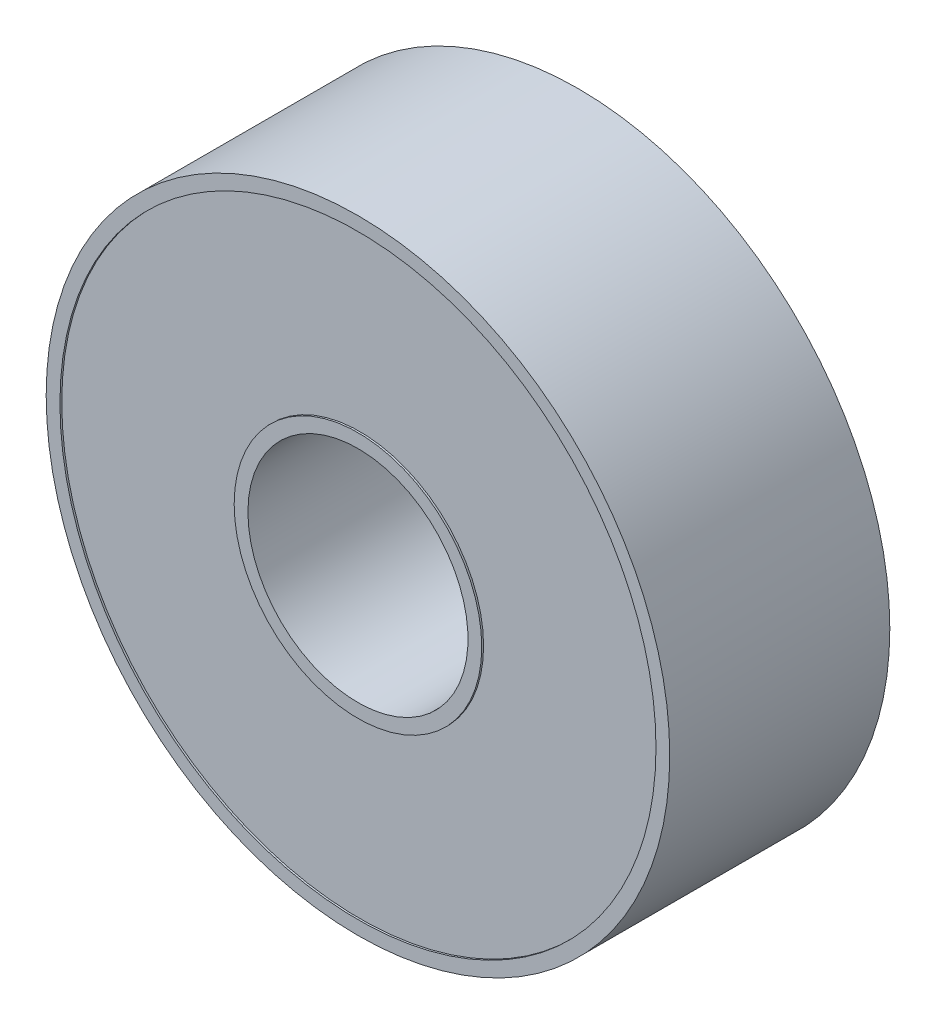
ISO-10303-21;
HEADER;
FILE_DESCRIPTION(('STEP AP214'),'2;1');
FILE_NAME('part.step','',(''),(''),'','','');
FILE_SCHEMA(('AUTOMOTIVE_DESIGN { 1 0 10303 214 1 1 1 1 }'));
ENDSEC;
DATA;
#1=APPLICATION_CONTEXT('core data for automotive mechanical design processes');
#2=APPLICATION_PROTOCOL_DEFINITION('international standard','automotive_design',2000,#1);
#3=PRODUCT_CONTEXT('',#1,'mechanical');
#4=PRODUCT('Part','Part','',(#3));
#5=PRODUCT_RELATED_PRODUCT_CATEGORY('part','',(#4));
#6=PRODUCT_DEFINITION_FORMATION('','',#4);
#7=PRODUCT_DEFINITION_CONTEXT('part definition',#1,'design');
#8=PRODUCT_DEFINITION('design','',#6,#7);
#9=PRODUCT_DEFINITION_SHAPE('','',#8);
#10=(LENGTH_UNIT() NAMED_UNIT(*) SI_UNIT(.MILLI.,.METRE.));
#11=(NAMED_UNIT(*) PLANE_ANGLE_UNIT() SI_UNIT($,.RADIAN.));
#12=(NAMED_UNIT(*) SI_UNIT($,.STERADIAN.) SOLID_ANGLE_UNIT());
#13=UNCERTAINTY_MEASURE_WITH_UNIT(LENGTH_MEASURE(1.E-05),#10,'distance_accuracy_value','');
#14=(GEOMETRIC_REPRESENTATION_CONTEXT(3) GLOBAL_UNCERTAINTY_ASSIGNED_CONTEXT((#13)) GLOBAL_UNIT_ASSIGNED_CONTEXT((#10,
#11,#12)) REPRESENTATION_CONTEXT('',''));
#15=CARTESIAN_POINT('',(0.,0.,0.));
#16=DIRECTION('',(0.,0.,1.));
#17=DIRECTION('',(1.,0.,0.));
#18=AXIS2_PLACEMENT_3D('',#15,#16,#17);
#19=CARTESIAN_POINT('',(0.,0.,0.));
#20=DIRECTION('',(0.,0.,1.));
#21=DIRECTION('',(1.,0.,0.));
#22=AXIS2_PLACEMENT_3D('',#19,#20,#21);
#23=PLANE('',#22);
#24=CARTESIAN_POINT('',(0.,0.,0.));
#25=DIRECTION('',(0.,0.,1.));
#26=DIRECTION('',(1.,0.,0.));
#27=AXIS2_PLACEMENT_3D('',#24,#25,#26);
#28=CIRCLE('',#27,8.5);
#29=CARTESIAN_POINT('',(-8.5,0.,0.));
#30=VERTEX_POINT('',#29);
#31=EDGE_CURVE('E40',#30,#30,#28,.T.);
#32=ORIENTED_EDGE('',*,*,#31,.F.);
#33=EDGE_LOOP('',(#32));
#34=FACE_BOUND('',#33,.T.);
#35=CARTESIAN_POINT('',(0.,0.,0.));
#36=DIRECTION('',(0.,0.,1.));
#37=DIRECTION('',(1.,0.,0.));
#38=AXIS2_PLACEMENT_3D('',#35,#36,#37);
#39=CIRCLE('',#38,8.125);
#40=CARTESIAN_POINT('',(-8.125,0.,0.));
#41=VERTEX_POINT('',#40);
#42=EDGE_CURVE('E10',#41,#41,#39,.T.);
#43=ORIENTED_EDGE('',*,*,#42,.T.);
#44=EDGE_LOOP('',(#43));
#45=FACE_BOUND('',#44,.T.);
#46=ADVANCED_FACE('F17',(#34,#45),#23,.F.);
#47=CARTESIAN_POINT('',(0.,0.,6.));
#48=DIRECTION('',(0.,0.,1.));
#49=DIRECTION('',(1.,0.,0.));
#50=AXIS2_PLACEMENT_3D('',#47,#48,#49);
#51=PLANE('',#50);
#52=CARTESIAN_POINT('',(0.,0.,6.));
#53=DIRECTION('',(0.,0.,1.));
#54=DIRECTION('',(1.,0.,0.));
#55=AXIS2_PLACEMENT_3D('',#52,#53,#54);
#56=CIRCLE('',#55,8.5);
#57=CARTESIAN_POINT('',(-8.5,0.,6.));
#58=VERTEX_POINT('',#57);
#59=EDGE_CURVE('E28',#58,#58,#56,.T.);
#60=ORIENTED_EDGE('',*,*,#59,.T.);
#61=EDGE_LOOP('',(#60));
#62=FACE_BOUND('',#61,.T.);
#63=CARTESIAN_POINT('',(0.,0.,6.));
#64=DIRECTION('',(0.,0.,-1.));
#65=DIRECTION('',(1.,0.,0.));
#66=AXIS2_PLACEMENT_3D('',#63,#64,#65);
#67=CIRCLE('',#66,8.125);
#68=CARTESIAN_POINT('',(-8.125,0.,6.));
#69=VERTEX_POINT('',#68);
#70=EDGE_CURVE('E173',#69,#69,#67,.T.);
#71=ORIENTED_EDGE('',*,*,#70,.T.);
#72=EDGE_LOOP('',(#71));
#73=FACE_BOUND('',#72,.T.);
#74=ADVANCED_FACE('F196',(#62,#73),#51,.T.);
#75=CARTESIAN_POINT('',(0.,0.,0.));
#76=DIRECTION('',(0.,0.,1.));
#77=DIRECTION('',(1.,0.,0.));
#78=AXIS2_PLACEMENT_3D('',#75,#76,#77);
#79=CYLINDRICAL_SURFACE('',#78,8.5);
#80=ORIENTED_EDGE('',*,*,#59,.F.);
#81=DIRECTION('',(0.,0.,-1.));
#82=VECTOR('',#81,1.);
#83=CARTESIAN_POINT('',(-8.5,0.,0.));
#84=LINE('',#83,#82);
#85=EDGE_CURVE('E169',#58,#30,#84,.T.);
#86=ORIENTED_EDGE('',*,*,#85,.T.);
#87=ORIENTED_EDGE('',*,*,#31,.T.);
#88=ORIENTED_EDGE('',*,*,#85,.F.);
#89=EDGE_LOOP('',(#80,#86,#87,#88));
#90=FACE_BOUND('',#89,.T.);
#91=ADVANCED_FACE('F194',(#90),#79,.T.);
#92=CARTESIAN_POINT('',(0.,0.,6.));
#93=DIRECTION('',(0.,0.,-1.));
#94=DIRECTION('',(1.,0.,0.));
#95=AXIS2_PLACEMENT_3D('',#92,#93,#94);
#96=CYLINDRICAL_SURFACE('',#95,8.125);
#97=ORIENTED_EDGE('',*,*,#70,.F.);
#98=DIRECTION('',(0.,0.,-1.));
#99=VECTOR('',#98,1.);
#100=CARTESIAN_POINT('',(-8.125,0.,6.));
#101=LINE('',#100,#99);
#102=CARTESIAN_POINT('',(-8.125,0.,5.95));
#103=VERTEX_POINT('',#102);
#104=EDGE_CURVE('E165',#69,#103,#101,.T.);
#105=ORIENTED_EDGE('',*,*,#104,.T.);
#106=CARTESIAN_POINT('',(0.,0.,5.95));
#107=DIRECTION('',(0.,0.,-1.));
#108=DIRECTION('',(1.,0.,0.));
#109=AXIS2_PLACEMENT_3D('',#106,#107,#108);
#110=CIRCLE('',#109,8.125);
#111=EDGE_CURVE('E161',#103,#103,#110,.T.);
#112=ORIENTED_EDGE('',*,*,#111,.T.);
#113=ORIENTED_EDGE('',*,*,#104,.F.);
#114=EDGE_LOOP('',(#97,#105,#112,#113));
#115=FACE_BOUND('',#114,.T.);
#116=ADVANCED_FACE('F202',(#115),#96,.F.);
#117=CARTESIAN_POINT('',(0.,0.,0.));
#118=DIRECTION('',(0.,0.,1.));
#119=DIRECTION('',(1.,0.,0.));
#120=AXIS2_PLACEMENT_3D('',#117,#118,#119);
#121=PLANE('',#120);
#122=CARTESIAN_POINT('',(0.,0.,0.));
#123=DIRECTION('',(0.,0.,-1.));
#124=DIRECTION('',(1.,0.,0.));
#125=AXIS2_PLACEMENT_3D('',#122,#123,#124);
#126=CIRCLE('',#125,3.375);
#127=CARTESIAN_POINT('',(-3.375,0.,0.));
#128=VERTEX_POINT('',#127);
#129=EDGE_CURVE('E150',#128,#128,#126,.T.);
#130=ORIENTED_EDGE('',*,*,#129,.T.);
#131=EDGE_LOOP('',(#130));
#132=FACE_BOUND('',#131,.T.);
#133=CARTESIAN_POINT('',(0.,0.,0.));
#134=DIRECTION('',(0.,0.,-1.));
#135=DIRECTION('',(1.,0.,0.));
#136=AXIS2_PLACEMENT_3D('',#133,#134,#135);
#137=CIRCLE('',#136,3.);
#138=CARTESIAN_POINT('',(-3.,0.,0.));
#139=VERTEX_POINT('',#138);
#140=EDGE_CURVE('E145',#139,#139,#137,.T.);
#141=ORIENTED_EDGE('',*,*,#140,.F.);
#142=EDGE_LOOP('',(#141));
#143=FACE_BOUND('',#142,.T.);
#144=ADVANCED_FACE('F217',(#132,#143),#121,.F.);
#145=CARTESIAN_POINT('',(0.,0.,6.));
#146=DIRECTION('',(0.,0.,1.));
#147=DIRECTION('',(1.,0.,0.));
#148=AXIS2_PLACEMENT_3D('',#145,#146,#147);
#149=PLANE('',#148);
#150=CARTESIAN_POINT('',(0.,0.,6.));
#151=DIRECTION('',(0.,0.,1.));
#152=DIRECTION('',(1.,0.,0.));
#153=AXIS2_PLACEMENT_3D('',#150,#151,#152);
#154=CIRCLE('',#153,3.375);
#155=CARTESIAN_POINT('',(-3.375,0.,6.));
#156=VERTEX_POINT('',#155);
#157=EDGE_CURVE('E146',#156,#156,#154,.T.);
#158=ORIENTED_EDGE('',*,*,#157,.T.);
#159=EDGE_LOOP('',(#158));
#160=FACE_BOUND('',#159,.T.);
#161=CARTESIAN_POINT('',(0.,0.,6.));
#162=DIRECTION('',(0.,0.,-1.));
#163=DIRECTION('',(1.,0.,0.));
#164=AXIS2_PLACEMENT_3D('',#161,#162,#163);
#165=CIRCLE('',#164,3.);
#166=CARTESIAN_POINT('',(-3.,0.,6.));
#167=VERTEX_POINT('',#166);
#168=EDGE_CURVE('E144',#167,#167,#165,.T.);
#169=ORIENTED_EDGE('',*,*,#168,.T.);
#170=EDGE_LOOP('',(#169));
#171=FACE_BOUND('',#170,.T.);
#172=ADVANCED_FACE('F213',(#160,#171),#149,.T.);
#173=CARTESIAN_POINT('',(0.,0.,0.));
#174=DIRECTION('',(0.,0.,1.));
#175=DIRECTION('',(1.,0.,0.));
#176=AXIS2_PLACEMENT_3D('',#173,#174,#175);
#177=CYLINDRICAL_SURFACE('',#176,3.);
#178=ORIENTED_EDGE('',*,*,#168,.F.);
#179=DIRECTION('',(0.,0.,-1.));
#180=VECTOR('',#179,1.);
#181=CARTESIAN_POINT('',(-3.,0.,0.));
#182=LINE('',#181,#180);
#183=EDGE_CURVE('E140',#167,#139,#182,.T.);
#184=ORIENTED_EDGE('',*,*,#183,.T.);
#185=ORIENTED_EDGE('',*,*,#140,.T.);
#186=ORIENTED_EDGE('',*,*,#183,.F.);
#187=EDGE_LOOP('',(#178,#184,#185,#186));
#188=FACE_BOUND('',#187,.T.);
#189=ADVANCED_FACE('F216',(#188),#177,.F.);
#190=CARTESIAN_POINT('',(0.,0.,6.));
#191=DIRECTION('',(0.,0.,-1.));
#192=DIRECTION('',(1.,0.,0.));
#193=AXIS2_PLACEMENT_3D('',#190,#191,#192);
#194=CYLINDRICAL_SURFACE('',#193,3.375);
#195=ORIENTED_EDGE('',*,*,#157,.F.);
#196=DIRECTION('',(0.,0.,-1.));
#197=VECTOR('',#196,1.);
#198=CARTESIAN_POINT('',(-3.375,0.,6.));
#199=LINE('',#198,#197);
#200=CARTESIAN_POINT('',(-3.375,0.,5.95));
#201=VERTEX_POINT('',#200);
#202=EDGE_CURVE('E154',#156,#201,#199,.T.);
#203=ORIENTED_EDGE('',*,*,#202,.T.);
#204=CARTESIAN_POINT('',(0.,0.,5.95));
#205=DIRECTION('',(0.,0.,1.));
#206=DIRECTION('',(1.,0.,0.));
#207=AXIS2_PLACEMENT_3D('',#204,#205,#206);
#208=CIRCLE('',#207,3.375);
#209=EDGE_CURVE('E139',#201,#201,#208,.T.);
#210=ORIENTED_EDGE('',*,*,#209,.T.);
#211=ORIENTED_EDGE('',*,*,#202,.F.);
#212=EDGE_LOOP('',(#195,#203,#210,#211));
#213=FACE_BOUND('',#212,.T.);
#214=ADVANCED_FACE('F208',(#213),#194,.T.);
#215=CARTESIAN_POINT('',(0.,0.,5.95));
#216=DIRECTION('',(0.,0.,1.));
#217=DIRECTION('',(1.,0.,0.));
#218=AXIS2_PLACEMENT_3D('',#215,#216,#217);
#219=PLANE('',#218);
#220=ORIENTED_EDGE('',*,*,#111,.F.);
#221=EDGE_LOOP('',(#220));
#222=FACE_BOUND('',#221,.T.);
#223=ORIENTED_EDGE('',*,*,#209,.F.);
#224=EDGE_LOOP('',(#223));
#225=FACE_BOUND('',#224,.T.);
#226=ADVANCED_FACE('F204',(#222,#225),#219,.T.);
#227=CARTESIAN_POINT('',(0.,0.,0.));
#228=DIRECTION('',(0.,0.,-1.));
#229=DIRECTION('',(1.,0.,0.));
#230=AXIS2_PLACEMENT_3D('',#227,#228,#229);
#231=CYLINDRICAL_SURFACE('',#230,8.125);
#232=ORIENTED_EDGE('',*,*,#42,.F.);
#233=DIRECTION('',(0.,0.,1.));
#234=VECTOR('',#233,1.);
#235=CARTESIAN_POINT('',(-8.125,0.,0.));
#236=LINE('',#235,#234);
#237=CARTESIAN_POINT('',(-8.125,0.,0.05));
#238=VERTEX_POINT('',#237);
#239=EDGE_CURVE('E135',#41,#238,#236,.T.);
#240=ORIENTED_EDGE('',*,*,#239,.T.);
#241=CARTESIAN_POINT('',(0.,0.,0.05));
#242=DIRECTION('',(0.,0.,1.));
#243=DIRECTION('',(1.,0.,0.));
#244=AXIS2_PLACEMENT_3D('',#241,#242,#243);
#245=CIRCLE('',#244,8.125);
#246=EDGE_CURVE('E134',#238,#238,#245,.T.);
#247=ORIENTED_EDGE('',*,*,#246,.T.);
#248=ORIENTED_EDGE('',*,*,#239,.F.);
#249=EDGE_LOOP('',(#232,#240,#247,#248));
#250=FACE_BOUND('',#249,.T.);
#251=ADVANCED_FACE('F207',(#250),#231,.F.);
#252=CARTESIAN_POINT('',(0.,0.,0.));
#253=DIRECTION('',(0.,0.,-1.));
#254=DIRECTION('',(1.,0.,0.));
#255=AXIS2_PLACEMENT_3D('',#252,#253,#254);
#256=CYLINDRICAL_SURFACE('',#255,3.375);
#257=ORIENTED_EDGE('',*,*,#129,.F.);
#258=DIRECTION('',(0.,0.,1.));
#259=VECTOR('',#258,1.);
#260=CARTESIAN_POINT('',(-3.375,0.,0.));
#261=LINE('',#260,#259);
#262=CARTESIAN_POINT('',(-3.375,0.,0.05));
#263=VERTEX_POINT('',#262);
#264=EDGE_CURVE('E130',#128,#263,#261,.T.);
#265=ORIENTED_EDGE('',*,*,#264,.T.);
#266=CARTESIAN_POINT('',(0.,0.,0.05));
#267=DIRECTION('',(0.,0.,-1.));
#268=DIRECTION('',(1.,0.,0.));
#269=AXIS2_PLACEMENT_3D('',#266,#267,#268);
#270=CIRCLE('',#269,3.375);
#271=EDGE_CURVE('E126',#263,#263,#270,.T.);
#272=ORIENTED_EDGE('',*,*,#271,.T.);
#273=ORIENTED_EDGE('',*,*,#264,.F.);
#274=EDGE_LOOP('',(#257,#265,#272,#273));
#275=FACE_BOUND('',#274,.T.);
#276=ADVANCED_FACE('F242',(#275),#256,.T.);
#277=CARTESIAN_POINT('',(0.,0.,0.05));
#278=DIRECTION('',(0.,0.,1.));
#279=DIRECTION('',(1.,0.,0.));
#280=AXIS2_PLACEMENT_3D('',#277,#278,#279);
#281=PLANE('',#280);
#282=ORIENTED_EDGE('',*,*,#246,.F.);
#283=EDGE_LOOP('',(#282));
#284=FACE_BOUND('',#283,.T.);
#285=ORIENTED_EDGE('',*,*,#271,.F.);
#286=EDGE_LOOP('',(#285));
#287=FACE_BOUND('',#286,.T.);
#288=ADVANCED_FACE('F244',(#284,#287),#281,.F.);
#289=CLOSED_SHELL('',(#46,#74,#91,#116,#144,#172,#189,#214,#226,#251,#276,#288));
#290=CARTESIAN_POINT('',(0.,0.,0.));
#291=DIRECTION('',(0.,0.,1.));
#292=DIRECTION('',(1.,0.,0.));
#293=AXIS2_PLACEMENT_3D('',#290,#291,#292);
#294=CYLINDRICAL_SURFACE('',#293,8.);
#295=DIRECTION('',(0.,0.,-1.));
#296=VECTOR('',#295,1.);
#297=CARTESIAN_POINT('',(-8.,0.,0.));
#298=LINE('',#297,#296);
#299=CARTESIAN_POINT('',(-8.,0.,5.5));
#300=VERTEX_POINT('',#299);
#301=CARTESIAN_POINT('',(-8.,0.,0.5));
#302=VERTEX_POINT('',#301);
#303=EDGE_CURVE('E21',#300,#302,#298,.T.);
#304=ORIENTED_EDGE('',*,*,#303,.F.);
#305=CARTESIAN_POINT('',(0.,0.,5.5));
#306=DIRECTION('',(0.,0.,1.));
#307=DIRECTION('',(1.,0.,0.));
#308=AXIS2_PLACEMENT_3D('',#305,#306,#307);
#309=CIRCLE('',#308,8.);
#310=EDGE_CURVE('E116',#300,#300,#309,.T.);
#311=ORIENTED_EDGE('',*,*,#310,.T.);
#312=ORIENTED_EDGE('',*,*,#303,.T.);
#313=CARTESIAN_POINT('',(0.,0.,0.5));
#314=DIRECTION('',(0.,0.,-1.));
#315=DIRECTION('',(1.,0.,0.));
#316=AXIS2_PLACEMENT_3D('',#313,#314,#315);
#317=CIRCLE('',#316,8.);
#318=EDGE_CURVE('E123',#302,#302,#317,.T.);
#319=ORIENTED_EDGE('',*,*,#318,.T.);
#320=EDGE_LOOP('',(#304,#311,#312,#319));
#321=FACE_BOUND('',#320,.T.);
#322=ADVANCED_FACE('F246',(#321),#294,.F.);
#323=CARTESIAN_POINT('',(0.,0.,0.));
#324=DIRECTION('',(0.,0.,1.));
#325=DIRECTION('',(1.,0.,0.));
#326=AXIS2_PLACEMENT_3D('',#323,#324,#325);
#327=CYLINDRICAL_SURFACE('',#326,3.5);
#328=DIRECTION('',(0.,0.,-1.));
#329=VECTOR('',#328,1.);
#330=CARTESIAN_POINT('',(-3.5,0.,0.));
#331=LINE('',#330,#329);
#332=CARTESIAN_POINT('',(-3.5,0.,5.5));
#333=VERTEX_POINT('',#332);
#334=CARTESIAN_POINT('',(-3.5,0.,0.5));
#335=VERTEX_POINT('',#334);
#336=EDGE_CURVE('E105',#333,#335,#331,.T.);
#337=ORIENTED_EDGE('',*,*,#336,.F.);
#338=CARTESIAN_POINT('',(0.,0.,5.5));
#339=DIRECTION('',(0.,0.,-1.));
#340=DIRECTION('',(1.,0.,0.));
#341=AXIS2_PLACEMENT_3D('',#338,#339,#340);
#342=CIRCLE('',#341,3.5);
#343=EDGE_CURVE('E107',#333,#333,#342,.T.);
#344=ORIENTED_EDGE('',*,*,#343,.T.);
#345=ORIENTED_EDGE('',*,*,#336,.T.);
#346=CARTESIAN_POINT('',(0.,0.,0.5));
#347=DIRECTION('',(0.,0.,1.));
#348=DIRECTION('',(1.,0.,0.));
#349=AXIS2_PLACEMENT_3D('',#346,#347,#348);
#350=CIRCLE('',#349,3.5);
#351=EDGE_CURVE('E109',#335,#335,#350,.T.);
#352=ORIENTED_EDGE('',*,*,#351,.T.);
#353=EDGE_LOOP('',(#337,#344,#345,#352));
#354=FACE_BOUND('',#353,.T.);
#355=ADVANCED_FACE('F19',(#354),#327,.T.);
#356=CARTESIAN_POINT('',(0.,0.,5.5));
#357=DIRECTION('',(0.,0.,1.));
#358=DIRECTION('',(1.,0.,0.));
#359=AXIS2_PLACEMENT_3D('',#356,#357,#358);
#360=PLANE('',#359);
#361=ORIENTED_EDGE('',*,*,#310,.F.);
#362=EDGE_LOOP('',(#361));
#363=FACE_BOUND('',#362,.T.);
#364=ORIENTED_EDGE('',*,*,#343,.F.);
#365=EDGE_LOOP('',(#364));
#366=FACE_BOUND('',#365,.T.);
#367=ADVANCED_FACE('F253',(#363,#366),#360,.F.);
#368=CARTESIAN_POINT('',(0.,0.,0.5));
#369=DIRECTION('',(0.,0.,1.));
#370=DIRECTION('',(1.,0.,0.));
#371=AXIS2_PLACEMENT_3D('',#368,#369,#370);
#372=PLANE('',#371);
#373=ORIENTED_EDGE('',*,*,#318,.F.);
#374=EDGE_LOOP('',(#373));
#375=FACE_BOUND('',#374,.T.);
#376=ORIENTED_EDGE('',*,*,#351,.F.);
#377=EDGE_LOOP('',(#376));
#378=FACE_BOUND('',#377,.T.);
#379=ADVANCED_FACE('F238',(#375,#378),#372,.T.);
#380=CLOSED_SHELL('',(#322,#355,#367,#379));
#381=ORIENTED_CLOSED_SHELL('',*,#380,.T.);
#382=BREP_WITH_VOIDS('B1',#289,(#381));
#383=ADVANCED_BREP_SHAPE_REPRESENTATION('',(#18,#382),#14);
#384=SHAPE_DEFINITION_REPRESENTATION(#9,#383);
ENDSEC;
END-ISO-10303-21;
